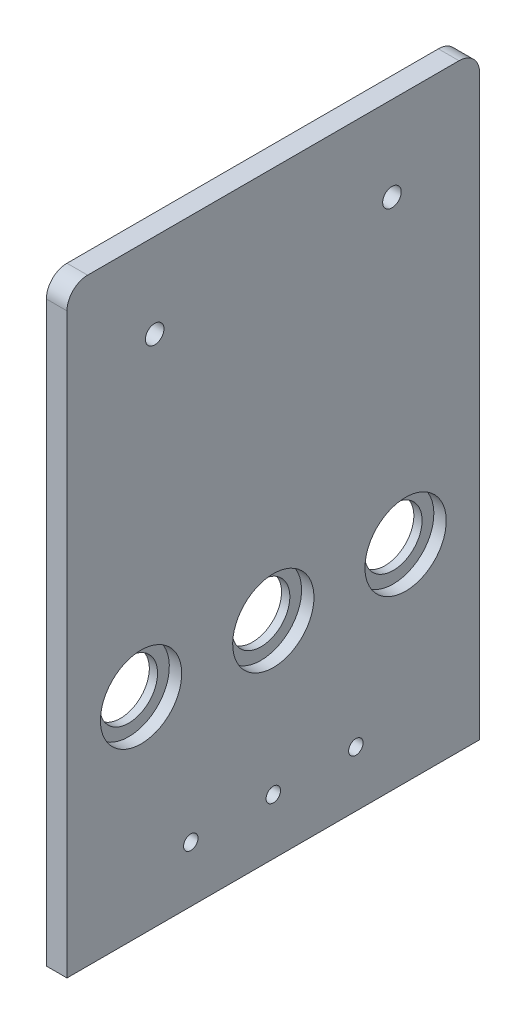
ISO-10303-21;
HEADER;
FILE_DESCRIPTION(('STEP AP214'),'2;1');
FILE_NAME('part.step','',(''),(''),'','','');
FILE_SCHEMA(('AUTOMOTIVE_DESIGN { 1 0 10303 214 1 1 1 1 }'));
ENDSEC;
DATA;
#1=APPLICATION_CONTEXT('core data for automotive mechanical design processes');
#2=APPLICATION_PROTOCOL_DEFINITION('international standard','automotive_design',2000,#1);
#3=PRODUCT_CONTEXT('',#1,'mechanical');
#4=PRODUCT('Part','Part','',(#3));
#5=PRODUCT_RELATED_PRODUCT_CATEGORY('part','',(#4));
#6=PRODUCT_DEFINITION_FORMATION('','',#4);
#7=PRODUCT_DEFINITION_CONTEXT('part definition',#1,'design');
#8=PRODUCT_DEFINITION('design','',#6,#7);
#9=PRODUCT_DEFINITION_SHAPE('','',#8);
#10=(LENGTH_UNIT() NAMED_UNIT(*) SI_UNIT(.MILLI.,.METRE.));
#11=(NAMED_UNIT(*) PLANE_ANGLE_UNIT() SI_UNIT($,.RADIAN.));
#12=(NAMED_UNIT(*) SI_UNIT($,.STERADIAN.) SOLID_ANGLE_UNIT());
#13=UNCERTAINTY_MEASURE_WITH_UNIT(LENGTH_MEASURE(1.E-05),#10,'distance_accuracy_value','');
#14=(GEOMETRIC_REPRESENTATION_CONTEXT(3) GLOBAL_UNCERTAINTY_ASSIGNED_CONTEXT((#13)) GLOBAL_UNIT_ASSIGNED_CONTEXT((#10,
#11,#12)) REPRESENTATION_CONTEXT('',''));
#15=CARTESIAN_POINT('',(0.,0.,0.));
#16=DIRECTION('',(0.,0.,1.));
#17=DIRECTION('',(1.,0.,0.));
#18=AXIS2_PLACEMENT_3D('',#15,#16,#17);
#19=CARTESIAN_POINT('',(0.,-5.,-100.));
#20=DIRECTION('',(0.,-1.,0.));
#21=DIRECTION('',(0.,0.,-1.));
#22=AXIS2_PLACEMENT_3D('',#19,#20,#21);
#23=PLANE('',#22);
#24=DIRECTION('',(1.,0.,0.));
#25=VECTOR('',#24,1.);
#26=CARTESIAN_POINT('',(0.,-5.,-100.));
#27=LINE('',#26,#25);
#28=CARTESIAN_POINT('',(-15.6006101249688,-5.,-100.));
#29=VERTEX_POINT('',#28);
#30=CARTESIAN_POINT('',(-10.6006101249688,-5.,-100.));
#31=VERTEX_POINT('',#30);
#32=EDGE_CURVE('E147',#29,#31,#27,.T.);
#33=ORIENTED_EDGE('',*,*,#32,.T.);
#34=DIRECTION('',(0.,0.,1.));
#35=VECTOR('',#34,1.);
#36=CARTESIAN_POINT('',(-10.6006101249688,-5.,-100.001));
#37=LINE('',#36,#35);
#38=CARTESIAN_POINT('',(-10.6006101249688,-5.,0.));
#39=VERTEX_POINT('',#38);
#40=EDGE_CURVE('E136',#31,#39,#37,.T.);
#41=ORIENTED_EDGE('',*,*,#40,.T.);
#42=DIRECTION('',(1.,0.,0.));
#43=VECTOR('',#42,1.);
#44=CARTESIAN_POINT('',(0.,-5.,0.));
#45=LINE('',#44,#43);
#46=CARTESIAN_POINT('',(-15.6006101249688,-5.,0.));
#47=VERTEX_POINT('',#46);
#48=EDGE_CURVE('E146',#47,#39,#45,.T.);
#49=ORIENTED_EDGE('',*,*,#48,.F.);
#50=DIRECTION('',(0.,0.,1.));
#51=VECTOR('',#50,1.);
#52=CARTESIAN_POINT('',(-15.6006101249688,-5.,-100.));
#53=LINE('',#52,#51);
#54=EDGE_CURVE('E161',#29,#47,#53,.T.);
#55=ORIENTED_EDGE('',*,*,#54,.F.);
#56=EDGE_LOOP('',(#33,#41,#49,#55));
#57=FACE_BOUND('',#56,.T.);
#58=ADVANCED_FACE('F80',(#57),#23,.T.);
#59=CARTESIAN_POINT('',(0.,0.,0.));
#60=DIRECTION('',(0.,0.,1.));
#61=DIRECTION('',(1.,0.,0.));
#62=AXIS2_PLACEMENT_3D('',#59,#60,#61);
#63=PLANE('',#62);
#64=ORIENTED_EDGE('',*,*,#48,.T.);
#65=DIRECTION('',(0.,-1.,0.));
#66=VECTOR('',#65,1.);
#67=CARTESIAN_POINT('',(-10.6006101249688,140.,0.));
#68=LINE('',#67,#66);
#69=CARTESIAN_POINT('',(-10.6006101249688,135.,0.));
#70=VERTEX_POINT('',#69);
#71=EDGE_CURVE('E132',#70,#39,#68,.T.);
#72=ORIENTED_EDGE('',*,*,#71,.F.);
#73=DIRECTION('',(1.,0.,0.));
#74=VECTOR('',#73,1.);
#75=CARTESIAN_POINT('',(-15.6006101249688,135.,0.));
#76=LINE('',#75,#74);
#77=CARTESIAN_POINT('',(-15.6006101249688,135.,0.));
#78=VERTEX_POINT('',#77);
#79=EDGE_CURVE('E12',#70,#78,#76,.F.);
#80=ORIENTED_EDGE('',*,*,#79,.T.);
#81=DIRECTION('',(0.,-1.,0.));
#82=VECTOR('',#81,1.);
#83=CARTESIAN_POINT('',(-15.6006101249688,0.,0.));
#84=LINE('',#83,#82);
#85=EDGE_CURVE('E152',#78,#47,#84,.T.);
#86=ORIENTED_EDGE('',*,*,#85,.T.);
#87=EDGE_LOOP('',(#64,#72,#80,#86));
#88=FACE_BOUND('',#87,.T.);
#89=ADVANCED_FACE('F151',(#88),#63,.T.);
#90=CARTESIAN_POINT('',(0.,0.,-100.));
#91=DIRECTION('',(0.,0.,1.));
#92=DIRECTION('',(1.,0.,0.));
#93=AXIS2_PLACEMENT_3D('',#90,#91,#92);
#94=PLANE('',#93);
#95=DIRECTION('',(0.,-1.,0.));
#96=VECTOR('',#95,1.);
#97=CARTESIAN_POINT('',(-10.6006101249688,140.,-100.));
#98=LINE('',#97,#96);
#99=CARTESIAN_POINT('',(-10.6006101249688,135.,-100.));
#100=VERTEX_POINT('',#99);
#101=EDGE_CURVE('E95',#100,#31,#98,.T.);
#102=ORIENTED_EDGE('',*,*,#101,.T.);
#103=ORIENTED_EDGE('',*,*,#32,.F.);
#104=DIRECTION('',(0.,-1.,0.));
#105=VECTOR('',#104,1.);
#106=CARTESIAN_POINT('',(-15.6006101249688,0.,-100.));
#107=LINE('',#106,#105);
#108=CARTESIAN_POINT('',(-15.6006101249688,135.,-100.));
#109=VERTEX_POINT('',#108);
#110=EDGE_CURVE('E154',#109,#29,#107,.T.);
#111=ORIENTED_EDGE('',*,*,#110,.F.);
#112=DIRECTION('',(1.,0.,0.));
#113=VECTOR('',#112,1.);
#114=CARTESIAN_POINT('',(0.,135.,-100.));
#115=LINE('',#114,#113);
#116=EDGE_CURVE('E163',#109,#100,#115,.T.);
#117=ORIENTED_EDGE('',*,*,#116,.T.);
#118=EDGE_LOOP('',(#102,#103,#111,#117));
#119=FACE_BOUND('',#118,.T.);
#120=ADVANCED_FACE('F200',(#119),#94,.F.);
#121=CARTESIAN_POINT('',(-10.6006101249688,140.,-100.));
#122=DIRECTION('',(-1.,0.,0.));
#123=DIRECTION('',(0.,-1.,0.));
#124=AXIS2_PLACEMENT_3D('',#121,#122,#123);
#125=PLANE('',#124);
#126=CARTESIAN_POINT('',(-10.6006101249688,8.49999999999999,-50.));
#127=DIRECTION('',(1.,0.,0.));
#128=DIRECTION('',(0.,1.,0.));
#129=AXIS2_PLACEMENT_3D('',#126,#127,#128);
#130=CIRCLE('',#129,1.75);
#131=CARTESIAN_POINT('',(-10.6006101249688,10.25,-50.));
#132=VERTEX_POINT('',#131);
#133=EDGE_CURVE('E240',#132,#132,#130,.T.);
#134=ORIENTED_EDGE('',*,*,#133,.F.);
#135=EDGE_LOOP('',(#134));
#136=FACE_BOUND('',#135,.T.);
#137=CARTESIAN_POINT('',(-10.6006101249688,8.49999999999999,-70.));
#138=DIRECTION('',(1.,0.,0.));
#139=DIRECTION('',(0.,1.,0.));
#140=AXIS2_PLACEMENT_3D('',#137,#138,#139);
#141=CIRCLE('',#140,1.75);
#142=CARTESIAN_POINT('',(-10.6006101249688,10.25,-70.));
#143=VERTEX_POINT('',#142);
#144=EDGE_CURVE('E244',#143,#143,#141,.T.);
#145=ORIENTED_EDGE('',*,*,#144,.F.);
#146=EDGE_LOOP('',(#145));
#147=FACE_BOUND('',#146,.T.);
#148=CARTESIAN_POINT('',(-10.6006101249688,8.49999999999999,-30.));
#149=DIRECTION('',(1.,0.,0.));
#150=DIRECTION('',(0.,1.,0.));
#151=AXIS2_PLACEMENT_3D('',#148,#149,#150);
#152=CIRCLE('',#151,1.75000000000001);
#153=CARTESIAN_POINT('',(-10.6006101249688,10.25,-30.));
#154=VERTEX_POINT('',#153);
#155=EDGE_CURVE('E149',#154,#154,#152,.T.);
#156=ORIENTED_EDGE('',*,*,#155,.F.);
#157=EDGE_LOOP('',(#156));
#158=FACE_BOUND('',#157,.T.);
#159=CARTESIAN_POINT('',(-10.6006101249688,119.5,-21.25));
#160=DIRECTION('',(-1.,0.,0.));
#161=DIRECTION('',(0.,-1.,0.));
#162=AXIS2_PLACEMENT_3D('',#159,#160,#161);
#163=CIRCLE('',#162,2.25);
#164=CARTESIAN_POINT('',(-10.6006101249688,121.75,-21.25));
#165=VERTEX_POINT('',#164);
#166=EDGE_CURVE('E148',#165,#165,#163,.F.);
#167=ORIENTED_EDGE('',*,*,#166,.F.);
#168=EDGE_LOOP('',(#167));
#169=FACE_BOUND('',#168,.T.);
#170=CARTESIAN_POINT('',(-10.6006101249688,119.5,-78.75));
#171=DIRECTION('',(-1.,0.,0.));
#172=DIRECTION('',(0.,-1.,0.));
#173=AXIS2_PLACEMENT_3D('',#170,#171,#172);
#174=CIRCLE('',#173,2.25);
#175=CARTESIAN_POINT('',(-10.6006101249688,121.75,-78.75));
#176=VERTEX_POINT('',#175);
#177=EDGE_CURVE('E178',#176,#176,#174,.F.);
#178=ORIENTED_EDGE('',*,*,#177,.F.);
#179=EDGE_LOOP('',(#178));
#180=FACE_BOUND('',#179,.T.);
#181=CARTESIAN_POINT('',(-10.6006101249688,45.,-50.));
#182=DIRECTION('',(-1.,0.,0.));
#183=DIRECTION('',(0.,-1.,0.));
#184=AXIS2_PLACEMENT_3D('',#181,#182,#183);
#185=CIRCLE('',#184,9.84999999999999);
#186=CARTESIAN_POINT('',(-10.6006101249688,35.15,-50.));
#187=VERTEX_POINT('',#186);
#188=EDGE_CURVE('E257',#187,#187,#185,.F.);
#189=ORIENTED_EDGE('',*,*,#188,.F.);
#190=EDGE_LOOP('',(#189));
#191=FACE_BOUND('',#190,.T.);
#192=CARTESIAN_POINT('',(-10.6006101249688,45.,-82.05));
#193=DIRECTION('',(-1.,0.,0.));
#194=DIRECTION('',(0.,-1.,0.));
#195=AXIS2_PLACEMENT_3D('',#192,#193,#194);
#196=CIRCLE('',#195,9.85);
#197=CARTESIAN_POINT('',(-10.6006101249688,35.15,-82.05));
#198=VERTEX_POINT('',#197);
#199=EDGE_CURVE('E260',#198,#198,#196,.F.);
#200=ORIENTED_EDGE('',*,*,#199,.F.);
#201=EDGE_LOOP('',(#200));
#202=FACE_BOUND('',#201,.T.);
#203=ORIENTED_EDGE('',*,*,#101,.F.);
#204=CARTESIAN_POINT('',(-10.6006101249688,135.,-95.));
#205=DIRECTION('',(-1.,0.,0.));
#206=DIRECTION('',(0.,-1.,0.));
#207=AXIS2_PLACEMENT_3D('',#204,#205,#206);
#208=CIRCLE('',#207,5.);
#209=CARTESIAN_POINT('',(-10.6006101249688,140.,-95.));
#210=VERTEX_POINT('',#209);
#211=EDGE_CURVE('E184',#100,#210,#208,.F.);
#212=ORIENTED_EDGE('',*,*,#211,.T.);
#213=DIRECTION('',(0.,0.,1.));
#214=VECTOR('',#213,1.);
#215=CARTESIAN_POINT('',(-10.6006101249688,140.,-100.));
#216=LINE('',#215,#214);
#217=CARTESIAN_POINT('',(-10.6006101249688,140.,-5.));
#218=VERTEX_POINT('',#217);
#219=EDGE_CURVE('E164',#210,#218,#216,.T.);
#220=ORIENTED_EDGE('',*,*,#219,.T.);
#221=CARTESIAN_POINT('',(-10.6006101249688,135.,-5.));
#222=DIRECTION('',(-1.,0.,0.));
#223=DIRECTION('',(0.,-1.,0.));
#224=AXIS2_PLACEMENT_3D('',#221,#222,#223);
#225=CIRCLE('',#224,5.);
#226=EDGE_CURVE('E139',#218,#70,#225,.F.);
#227=ORIENTED_EDGE('',*,*,#226,.T.);
#228=ORIENTED_EDGE('',*,*,#71,.T.);
#229=ORIENTED_EDGE('',*,*,#40,.F.);
#230=EDGE_LOOP('',(#203,#212,#220,#227,#228,#229));
#231=FACE_BOUND('',#230,.T.);
#232=CARTESIAN_POINT('',(-10.6006101249688,45.,-17.95));
#233=DIRECTION('',(-1.,0.,0.));
#234=DIRECTION('',(0.,-1.,0.));
#235=AXIS2_PLACEMENT_3D('',#232,#233,#234);
#236=CIRCLE('',#235,9.85);
#237=CARTESIAN_POINT('',(-10.6006101249688,35.15,-17.95));
#238=VERTEX_POINT('',#237);
#239=EDGE_CURVE('E169',#238,#238,#236,.F.);
#240=ORIENTED_EDGE('',*,*,#239,.F.);
#241=EDGE_LOOP('',(#240));
#242=FACE_BOUND('',#241,.T.);
#243=ADVANCED_FACE('F134',(#136,#147,#158,#169,#180,#191,#202,#231,#242),#125,.F.);
#244=CARTESIAN_POINT('',(-15.6006101249688,0.,-100.));
#245=DIRECTION('',(-1.,0.,0.));
#246=DIRECTION('',(0.,-1.,0.));
#247=AXIS2_PLACEMENT_3D('',#244,#245,#246);
#248=PLANE('',#247);
#249=CARTESIAN_POINT('',(-15.6006101249688,8.49999999999999,-50.));
#250=DIRECTION('',(-1.,0.,0.));
#251=DIRECTION('',(0.,-1.,0.));
#252=AXIS2_PLACEMENT_3D('',#249,#250,#251);
#253=CIRCLE('',#252,1.75);
#254=CARTESIAN_POINT('',(-15.6006101249688,6.74999999999998,-50.));
#255=VERTEX_POINT('',#254);
#256=EDGE_CURVE('E343',#255,#255,#253,.F.);
#257=ORIENTED_EDGE('',*,*,#256,.T.);
#258=EDGE_LOOP('',(#257));
#259=FACE_BOUND('',#258,.T.);
#260=CARTESIAN_POINT('',(-15.6006101249688,8.49999999999999,-70.));
#261=DIRECTION('',(-1.,0.,0.));
#262=DIRECTION('',(0.,-1.,0.));
#263=AXIS2_PLACEMENT_3D('',#260,#261,#262);
#264=CIRCLE('',#263,1.75);
#265=CARTESIAN_POINT('',(-15.6006101249688,6.74999999999999,-70.));
#266=VERTEX_POINT('',#265);
#267=EDGE_CURVE('E351',#266,#266,#264,.F.);
#268=ORIENTED_EDGE('',*,*,#267,.T.);
#269=EDGE_LOOP('',(#268));
#270=FACE_BOUND('',#269,.T.);
#271=CARTESIAN_POINT('',(-15.6006101249688,8.49999999999999,-30.));
#272=DIRECTION('',(-1.,0.,0.));
#273=DIRECTION('',(0.,-1.,0.));
#274=AXIS2_PLACEMENT_3D('',#271,#272,#273);
#275=CIRCLE('',#274,1.75000000000001);
#276=CARTESIAN_POINT('',(-15.6006101249688,6.74999999999998,-30.));
#277=VERTEX_POINT('',#276);
#278=EDGE_CURVE('E344',#277,#277,#275,.F.);
#279=ORIENTED_EDGE('',*,*,#278,.T.);
#280=EDGE_LOOP('',(#279));
#281=FACE_BOUND('',#280,.T.);
#282=CARTESIAN_POINT('',(-15.6006101249688,119.5,-21.25));
#283=DIRECTION('',(-1.,0.,0.));
#284=DIRECTION('',(0.,-1.,0.));
#285=AXIS2_PLACEMENT_3D('',#282,#283,#284);
#286=CIRCLE('',#285,2.25);
#287=CARTESIAN_POINT('',(-15.6006101249688,121.75,-21.25));
#288=VERTEX_POINT('',#287);
#289=EDGE_CURVE('E179',#288,#288,#286,.F.);
#290=ORIENTED_EDGE('',*,*,#289,.T.);
#291=EDGE_LOOP('',(#290));
#292=FACE_BOUND('',#291,.T.);
#293=CARTESIAN_POINT('',(-15.6006101249688,119.5,-78.75));
#294=DIRECTION('',(-1.,0.,0.));
#295=DIRECTION('',(0.,-1.,0.));
#296=AXIS2_PLACEMENT_3D('',#293,#294,#295);
#297=CIRCLE('',#296,2.25);
#298=CARTESIAN_POINT('',(-15.6006101249688,121.75,-78.75));
#299=VERTEX_POINT('',#298);
#300=EDGE_CURVE('E174',#299,#299,#297,.F.);
#301=ORIENTED_EDGE('',*,*,#300,.T.);
#302=EDGE_LOOP('',(#301));
#303=FACE_BOUND('',#302,.T.);
#304=CARTESIAN_POINT('',(-15.6006101249688,45.,-50.));
#305=DIRECTION('',(-1.,0.,0.));
#306=DIRECTION('',(0.,0.,1.));
#307=AXIS2_PLACEMENT_3D('',#304,#305,#306);
#308=CIRCLE('',#307,7.);
#309=CARTESIAN_POINT('',(-15.6006101249688,45.,-43.));
#310=VERTEX_POINT('',#309);
#311=EDGE_CURVE('E277',#310,#310,#308,.T.);
#312=ORIENTED_EDGE('',*,*,#311,.F.);
#313=EDGE_LOOP('',(#312));
#314=FACE_BOUND('',#313,.T.);
#315=CARTESIAN_POINT('',(-15.6006101249688,45.,-17.95));
#316=DIRECTION('',(-1.,0.,0.));
#317=DIRECTION('',(0.,0.,1.));
#318=AXIS2_PLACEMENT_3D('',#315,#316,#317);
#319=CIRCLE('',#318,7.);
#320=CARTESIAN_POINT('',(-15.6006101249688,45.,-10.95));
#321=VERTEX_POINT('',#320);
#322=EDGE_CURVE('E172',#321,#321,#319,.T.);
#323=ORIENTED_EDGE('',*,*,#322,.F.);
#324=EDGE_LOOP('',(#323));
#325=FACE_BOUND('',#324,.T.);
#326=CARTESIAN_POINT('',(-15.6006101249688,45.,-82.05));
#327=DIRECTION('',(-1.,0.,0.));
#328=DIRECTION('',(0.,0.,1.));
#329=AXIS2_PLACEMENT_3D('',#326,#327,#328);
#330=CIRCLE('',#329,7.);
#331=CARTESIAN_POINT('',(-15.6006101249688,45.,-75.05));
#332=VERTEX_POINT('',#331);
#333=EDGE_CURVE('E141',#332,#332,#330,.T.);
#334=ORIENTED_EDGE('',*,*,#333,.F.);
#335=EDGE_LOOP('',(#334));
#336=FACE_BOUND('',#335,.T.);
#337=DIRECTION('',(0.,0.,1.));
#338=VECTOR('',#337,1.);
#339=CARTESIAN_POINT('',(-15.6006101249688,140.,-100.));
#340=LINE('',#339,#338);
#341=CARTESIAN_POINT('',(-15.6006101249688,140.,-95.));
#342=VERTEX_POINT('',#341);
#343=CARTESIAN_POINT('',(-15.6006101249688,140.,-5.));
#344=VERTEX_POINT('',#343);
#345=EDGE_CURVE('E157',#342,#344,#340,.T.);
#346=ORIENTED_EDGE('',*,*,#345,.F.);
#347=CARTESIAN_POINT('',(-15.6006101249688,135.,-95.));
#348=DIRECTION('',(-1.,0.,0.));
#349=DIRECTION('',(0.,-1.,0.));
#350=AXIS2_PLACEMENT_3D('',#347,#348,#349);
#351=CIRCLE('',#350,5.);
#352=EDGE_CURVE('E88',#342,#109,#351,.T.);
#353=ORIENTED_EDGE('',*,*,#352,.T.);
#354=ORIENTED_EDGE('',*,*,#110,.T.);
#355=ORIENTED_EDGE('',*,*,#54,.T.);
#356=ORIENTED_EDGE('',*,*,#85,.F.);
#357=CARTESIAN_POINT('',(-15.6006101249688,135.,-5.));
#358=DIRECTION('',(-1.,0.,0.));
#359=DIRECTION('',(0.,-1.,0.));
#360=AXIS2_PLACEMENT_3D('',#357,#358,#359);
#361=CIRCLE('',#360,5.);
#362=EDGE_CURVE('E191',#78,#344,#361,.T.);
#363=ORIENTED_EDGE('',*,*,#362,.T.);
#364=EDGE_LOOP('',(#346,#353,#354,#355,#356,#363));
#365=FACE_BOUND('',#364,.T.);
#366=ADVANCED_FACE('F196',(#259,#270,#281,#292,#303,#314,#325,#336,#365),#248,.T.);
#367=CARTESIAN_POINT('',(-15.6006101249688,140.,-100.));
#368=DIRECTION('',(0.,-1.,0.));
#369=DIRECTION('',(0.,0.,-1.));
#370=AXIS2_PLACEMENT_3D('',#367,#368,#369);
#371=PLANE('',#370);
#372=ORIENTED_EDGE('',*,*,#219,.F.);
#373=DIRECTION('',(1.,0.,0.));
#374=VECTOR('',#373,1.);
#375=CARTESIAN_POINT('',(-15.6006101249688,140.,-95.));
#376=LINE('',#375,#374);
#377=EDGE_CURVE('E189',#210,#342,#376,.F.);
#378=ORIENTED_EDGE('',*,*,#377,.T.);
#379=ORIENTED_EDGE('',*,*,#345,.T.);
#380=DIRECTION('',(1.,0.,0.));
#381=VECTOR('',#380,1.);
#382=CARTESIAN_POINT('',(-10.6006101249688,140.,-5.));
#383=LINE('',#382,#381);
#384=EDGE_CURVE('E186',#344,#218,#383,.T.);
#385=ORIENTED_EDGE('',*,*,#384,.T.);
#386=EDGE_LOOP('',(#372,#378,#379,#385));
#387=FACE_BOUND('',#386,.T.);
#388=ADVANCED_FACE('F204',(#387),#371,.F.);
#389=CARTESIAN_POINT('',(-15.6006101249688,45.,-82.05));
#390=DIRECTION('',(1.,0.,0.));
#391=DIRECTION('',(0.,0.,-1.));
#392=AXIS2_PLACEMENT_3D('',#389,#390,#391);
#393=CYLINDRICAL_SURFACE('',#392,7.);
#394=CARTESIAN_POINT('',(-13.6006101249688,45.,-82.05));
#395=DIRECTION('',(-1.,0.,0.));
#396=DIRECTION('',(0.,0.,1.));
#397=AXIS2_PLACEMENT_3D('',#394,#395,#396);
#398=CIRCLE('',#397,7.);
#399=CARTESIAN_POINT('',(-13.6006101249688,45.,-75.05));
#400=VERTEX_POINT('',#399);
#401=EDGE_CURVE('E177',#400,#400,#398,.T.);
#402=ORIENTED_EDGE('',*,*,#401,.F.);
#403=EDGE_LOOP('',(#402));
#404=FACE_BOUND('',#403,.T.);
#405=ORIENTED_EDGE('',*,*,#333,.T.);
#406=EDGE_LOOP('',(#405));
#407=FACE_BOUND('',#406,.T.);
#408=ADVANCED_FACE('F229',(#404,#407),#393,.F.);
#409=CARTESIAN_POINT('',(-15.6006101249688,45.,-17.95));
#410=DIRECTION('',(1.,0.,0.));
#411=DIRECTION('',(0.,0.,-1.));
#412=AXIS2_PLACEMENT_3D('',#409,#410,#411);
#413=CYLINDRICAL_SURFACE('',#412,7.);
#414=CARTESIAN_POINT('',(-13.6006101249688,45.,-17.95));
#415=DIRECTION('',(-1.,0.,0.));
#416=DIRECTION('',(0.,0.,1.));
#417=AXIS2_PLACEMENT_3D('',#414,#415,#416);
#418=CIRCLE('',#417,7.);
#419=CARTESIAN_POINT('',(-13.6006101249688,45.,-10.95));
#420=VERTEX_POINT('',#419);
#421=EDGE_CURVE('E173',#420,#420,#418,.T.);
#422=ORIENTED_EDGE('',*,*,#421,.F.);
#423=EDGE_LOOP('',(#422));
#424=FACE_BOUND('',#423,.T.);
#425=ORIENTED_EDGE('',*,*,#322,.T.);
#426=EDGE_LOOP('',(#425));
#427=FACE_BOUND('',#426,.T.);
#428=ADVANCED_FACE('F287',(#424,#427),#413,.F.);
#429=CARTESIAN_POINT('',(-15.6006101249688,45.,-50.));
#430=DIRECTION('',(1.,0.,0.));
#431=DIRECTION('',(0.,0.,-1.));
#432=AXIS2_PLACEMENT_3D('',#429,#430,#431);
#433=CYLINDRICAL_SURFACE('',#432,7.);
#434=CARTESIAN_POINT('',(-13.6006101249688,45.,-50.));
#435=DIRECTION('',(-1.,0.,0.));
#436=DIRECTION('',(0.,0.,1.));
#437=AXIS2_PLACEMENT_3D('',#434,#435,#436);
#438=CIRCLE('',#437,7.);
#439=CARTESIAN_POINT('',(-13.6006101249688,45.,-43.));
#440=VERTEX_POINT('',#439);
#441=EDGE_CURVE('E262',#440,#440,#438,.T.);
#442=ORIENTED_EDGE('',*,*,#441,.F.);
#443=EDGE_LOOP('',(#442));
#444=FACE_BOUND('',#443,.T.);
#445=ORIENTED_EDGE('',*,*,#311,.T.);
#446=EDGE_LOOP('',(#445));
#447=FACE_BOUND('',#446,.T.);
#448=ADVANCED_FACE('F293',(#444,#447),#433,.F.);
#449=CARTESIAN_POINT('',(-13.6006101249688,45.,-17.95));
#450=DIRECTION('',(1.,0.,0.));
#451=DIRECTION('',(0.,0.,-1.));
#452=AXIS2_PLACEMENT_3D('',#449,#450,#451);
#453=CYLINDRICAL_SURFACE('',#452,9.85);
#454=CARTESIAN_POINT('',(-13.6006101249688,45.,-17.95));
#455=DIRECTION('',(-1.,0.,0.));
#456=DIRECTION('',(0.,0.,1.));
#457=AXIS2_PLACEMENT_3D('',#454,#455,#456);
#458=CIRCLE('',#457,9.85);
#459=CARTESIAN_POINT('',(-13.6006101249688,45.,-8.10000000000001));
#460=VERTEX_POINT('',#459);
#461=EDGE_CURVE('E264',#460,#460,#458,.T.);
#462=ORIENTED_EDGE('',*,*,#461,.T.);
#463=EDGE_LOOP('',(#462));
#464=FACE_BOUND('',#463,.T.);
#465=ORIENTED_EDGE('',*,*,#239,.T.);
#466=EDGE_LOOP('',(#465));
#467=FACE_BOUND('',#466,.T.);
#468=ADVANCED_FACE('F300',(#464,#467),#453,.F.);
#469=CARTESIAN_POINT('',(-13.6006101249688,0.,0.));
#470=DIRECTION('',(-1.,0.,0.));
#471=DIRECTION('',(0.,0.,1.));
#472=AXIS2_PLACEMENT_3D('',#469,#470,#471);
#473=PLANE('',#472);
#474=ORIENTED_EDGE('',*,*,#461,.F.);
#475=EDGE_LOOP('',(#474));
#476=FACE_BOUND('',#475,.T.);
#477=ORIENTED_EDGE('',*,*,#421,.T.);
#478=EDGE_LOOP('',(#477));
#479=FACE_BOUND('',#478,.T.);
#480=ADVANCED_FACE('F304',(#476,#479),#473,.F.);
#481=CARTESIAN_POINT('',(-13.6006101249688,45.,-50.));
#482=DIRECTION('',(1.,0.,0.));
#483=DIRECTION('',(0.,0.,-1.));
#484=AXIS2_PLACEMENT_3D('',#481,#482,#483);
#485=CYLINDRICAL_SURFACE('',#484,9.84999999999999);
#486=CARTESIAN_POINT('',(-13.6006101249688,45.,-50.));
#487=DIRECTION('',(-1.,0.,0.));
#488=DIRECTION('',(0.,0.,1.));
#489=AXIS2_PLACEMENT_3D('',#486,#487,#488);
#490=CIRCLE('',#489,9.84999999999999);
#491=CARTESIAN_POINT('',(-13.6006101249688,45.,-40.15));
#492=VERTEX_POINT('',#491);
#493=EDGE_CURVE('E267',#492,#492,#490,.T.);
#494=ORIENTED_EDGE('',*,*,#493,.T.);
#495=EDGE_LOOP('',(#494));
#496=FACE_BOUND('',#495,.T.);
#497=ORIENTED_EDGE('',*,*,#188,.T.);
#498=EDGE_LOOP('',(#497));
#499=FACE_BOUND('',#498,.T.);
#500=ADVANCED_FACE('F308',(#496,#499),#485,.F.);
#501=CARTESIAN_POINT('',(-13.6006101249688,0.,0.));
#502=DIRECTION('',(-1.,0.,0.));
#503=DIRECTION('',(0.,0.,1.));
#504=AXIS2_PLACEMENT_3D('',#501,#502,#503);
#505=PLANE('',#504);
#506=ORIENTED_EDGE('',*,*,#493,.F.);
#507=EDGE_LOOP('',(#506));
#508=FACE_BOUND('',#507,.T.);
#509=ORIENTED_EDGE('',*,*,#441,.T.);
#510=EDGE_LOOP('',(#509));
#511=FACE_BOUND('',#510,.T.);
#512=ADVANCED_FACE('F314',(#508,#511),#505,.F.);
#513=CARTESIAN_POINT('',(-13.6006101249688,45.,-82.05));
#514=DIRECTION('',(1.,0.,0.));
#515=DIRECTION('',(0.,0.,-1.));
#516=AXIS2_PLACEMENT_3D('',#513,#514,#515);
#517=CYLINDRICAL_SURFACE('',#516,9.85);
#518=CARTESIAN_POINT('',(-13.6006101249688,45.,-82.05));
#519=DIRECTION('',(-1.,0.,0.));
#520=DIRECTION('',(0.,0.,1.));
#521=AXIS2_PLACEMENT_3D('',#518,#519,#520);
#522=CIRCLE('',#521,9.85);
#523=CARTESIAN_POINT('',(-13.6006101249688,45.,-72.2));
#524=VERTEX_POINT('',#523);
#525=EDGE_CURVE('E270',#524,#524,#522,.T.);
#526=ORIENTED_EDGE('',*,*,#525,.T.);
#527=EDGE_LOOP('',(#526));
#528=FACE_BOUND('',#527,.T.);
#529=ORIENTED_EDGE('',*,*,#199,.T.);
#530=EDGE_LOOP('',(#529));
#531=FACE_BOUND('',#530,.T.);
#532=ADVANCED_FACE('F310',(#528,#531),#517,.F.);
#533=CARTESIAN_POINT('',(-13.6006101249688,0.,0.));
#534=DIRECTION('',(-1.,0.,0.));
#535=DIRECTION('',(0.,0.,1.));
#536=AXIS2_PLACEMENT_3D('',#533,#534,#535);
#537=PLANE('',#536);
#538=ORIENTED_EDGE('',*,*,#401,.T.);
#539=EDGE_LOOP('',(#538));
#540=FACE_BOUND('',#539,.T.);
#541=ORIENTED_EDGE('',*,*,#525,.F.);
#542=EDGE_LOOP('',(#541));
#543=FACE_BOUND('',#542,.T.);
#544=ADVANCED_FACE('F313',(#540,#543),#537,.F.);
#545=CARTESIAN_POINT('',(-15.6006221249688,119.5,-78.75));
#546=DIRECTION('',(1.,0.,0.));
#547=DIRECTION('',(0.,1.,0.));
#548=AXIS2_PLACEMENT_3D('',#545,#546,#547);
#549=CYLINDRICAL_SURFACE('',#548,2.25);
#550=CARTESIAN_POINT('',(-15.6006101249688,121.75,-78.75));
#551=CARTESIAN_POINT('',(-15.5485267916355,121.75,-78.75));
#552=CARTESIAN_POINT('',(-15.4964434583021,121.75,-78.75));
#553=CARTESIAN_POINT('',(-15.3922767916355,121.75,-78.75));
#554=CARTESIAN_POINT('',(-15.3401934583021,121.75,-78.75));
#555=CARTESIAN_POINT('',(-15.2360267916355,121.75,-78.75));
#556=CARTESIAN_POINT('',(-15.1839434583021,121.75,-78.75));
#557=CARTESIAN_POINT('',(-15.0797767916355,121.75,-78.75));
#558=CARTESIAN_POINT('',(-15.0276934583021,121.75,-78.75));
#559=CARTESIAN_POINT('',(-14.9235267916355,121.75,-78.75));
#560=CARTESIAN_POINT('',(-14.8714434583021,121.75,-78.75));
#561=CARTESIAN_POINT('',(-14.7672767916355,121.75,-78.75));
#562=CARTESIAN_POINT('',(-14.7151934583021,121.75,-78.75));
#563=CARTESIAN_POINT('',(-14.6110267916355,121.75,-78.75));
#564=CARTESIAN_POINT('',(-14.5589434583021,121.75,-78.75));
#565=CARTESIAN_POINT('',(-14.4547767916355,121.75,-78.75));
#566=CARTESIAN_POINT('',(-14.4026934583021,121.75,-78.75));
#567=CARTESIAN_POINT('',(-14.2985267916355,121.75,-78.75));
#568=CARTESIAN_POINT('',(-14.2464434583021,121.75,-78.75));
#569=CARTESIAN_POINT('',(-14.1422767916355,121.75,-78.75));
#570=CARTESIAN_POINT('',(-14.0901934583021,121.75,-78.75));
#571=CARTESIAN_POINT('',(-13.9860267916355,121.75,-78.75));
#572=CARTESIAN_POINT('',(-13.9339434583021,121.75,-78.75));
#573=CARTESIAN_POINT('',(-13.8297767916355,121.75,-78.75));
#574=CARTESIAN_POINT('',(-13.7776934583021,121.75,-78.75));
#575=CARTESIAN_POINT('',(-13.6735267916355,121.75,-78.75));
#576=CARTESIAN_POINT('',(-13.6214434583021,121.75,-78.75));
#577=CARTESIAN_POINT('',(-13.5172767916355,121.75,-78.75));
#578=CARTESIAN_POINT('',(-13.4651934583021,121.75,-78.75));
#579=CARTESIAN_POINT('',(-13.3610267916355,121.75,-78.75));
#580=CARTESIAN_POINT('',(-13.3089434583021,121.75,-78.75));
#581=CARTESIAN_POINT('',(-13.2047767916355,121.75,-78.75));
#582=CARTESIAN_POINT('',(-13.1526934583021,121.75,-78.75));
#583=CARTESIAN_POINT('',(-13.0485267916354,121.75,-78.75));
#584=CARTESIAN_POINT('',(-12.9964434583021,121.75,-78.75));
#585=CARTESIAN_POINT('',(-12.8922767916354,121.75,-78.75));
#586=CARTESIAN_POINT('',(-12.8401934583021,121.75,-78.75));
#587=CARTESIAN_POINT('',(-12.7360267916354,121.75,-78.75));
#588=CARTESIAN_POINT('',(-12.6839434583021,121.75,-78.75));
#589=CARTESIAN_POINT('',(-12.5797767916354,121.75,-78.75));
#590=CARTESIAN_POINT('',(-12.5276934583021,121.75,-78.75));
#591=CARTESIAN_POINT('',(-12.4235267916354,121.75,-78.75));
#592=CARTESIAN_POINT('',(-12.3714434583021,121.75,-78.75));
#593=CARTESIAN_POINT('',(-12.2672767916354,121.75,-78.75));
#594=CARTESIAN_POINT('',(-12.2151934583021,121.75,-78.75));
#595=CARTESIAN_POINT('',(-12.1110267916354,121.75,-78.75));
#596=CARTESIAN_POINT('',(-12.0589434583021,121.75,-78.75));
#597=CARTESIAN_POINT('',(-11.9547767916354,121.75,-78.75));
#598=CARTESIAN_POINT('',(-11.9026934583021,121.75,-78.75));
#599=CARTESIAN_POINT('',(-11.7985267916354,121.75,-78.75));
#600=CARTESIAN_POINT('',(-11.7464434583021,121.75,-78.75));
#601=CARTESIAN_POINT('',(-11.6422767916354,121.75,-78.75));
#602=CARTESIAN_POINT('',(-11.5901934583021,121.75,-78.75));
#603=CARTESIAN_POINT('',(-11.4860267916354,121.75,-78.75));
#604=CARTESIAN_POINT('',(-11.4339434583021,121.75,-78.75));
#605=CARTESIAN_POINT('',(-11.3297767916354,121.75,-78.75));
#606=CARTESIAN_POINT('',(-11.2776934583021,121.75,-78.75));
#607=CARTESIAN_POINT('',(-11.1735267916354,121.75,-78.75));
#608=CARTESIAN_POINT('',(-11.1214434583021,121.75,-78.75));
#609=CARTESIAN_POINT('',(-11.0172767916354,121.75,-78.75));
#610=CARTESIAN_POINT('',(-10.9651934583021,121.75,-78.75));
#611=CARTESIAN_POINT('',(-10.8610267916354,121.75,-78.75));
#612=CARTESIAN_POINT('',(-10.8089434583021,121.75,-78.75));
#613=CARTESIAN_POINT('',(-10.7047767916354,121.75,-78.75));
#614=CARTESIAN_POINT('',(-10.6526934583021,121.75,-78.75));
#615=CARTESIAN_POINT('',(-10.6006101249688,121.75,-78.75));
#616=B_SPLINE_CURVE_WITH_KNOTS('',3,(#550,#551,#552,#553,#554,#555,#556,#557,#558,#559,#560,
#561,#562,#563,#564,#565,#566,#567,#568,#569,#570,#571,#572,#573,#574,#575,#576,#577,#578,#579,
#580,#581,#582,#583,#584,#585,#586,#587,#588,#589,#590,#591,#592,#593,#594,#595,#596,#597,#598,
#599,#600,#601,#602,#603,#604,#605,#606,#607,#608,#609,#610,#611,#612,#613,#614,#615),
.UNSPECIFIED.,.F.,.F.,(4,2,2,2,2,2,2,2,2,2,2,2,2,2,2,2,2,2,2,2,2,2,2,2,2,2,2,2,2,2,2,2,4),(0.,
0.156250000000002,0.312500000000002,0.468750000000004,0.625000000000004,0.781250000000006,
0.937500000000006,1.09375000000001,1.25000000000001,1.40625000000001,1.56250000000001,
1.71875000000001,1.87500000000001,2.03125000000001,2.18750000000001,2.34375000000001,
2.50000000000001,2.65625000000002,2.81250000000002,2.96875000000002,3.12500000000002,
3.28125000000002,3.43750000000002,3.59375000000002,3.75000000000002,3.90625000000002,
4.06250000000002,4.21875000000002,4.37500000000003,4.53125000000003,4.68750000000003,
4.84375000000003,5.00000000000003),.UNSPECIFIED.);
#617=EDGE_CURVE('BSEAM318',#299,#176,#616,.T.);
#618=ORIENTED_EDGE('',*,*,#300,.F.);
#619=ORIENTED_EDGE('',*,*,#177,.T.);
#620=ORIENTED_EDGE('',*,*,#617,.T.);
#621=ORIENTED_EDGE('',*,*,#617,.F.);
#622=EDGE_LOOP('',(#618,#620,#619,#621));
#623=FACE_BOUND('',#622,.T.);
#624=ADVANCED_FACE('F318',(#623),#549,.F.);
#625=CARTESIAN_POINT('',(-15.6006221249688,119.5,-21.25));
#626=DIRECTION('',(1.,0.,0.));
#627=DIRECTION('',(0.,1.,0.));
#628=AXIS2_PLACEMENT_3D('',#625,#626,#627);
#629=CYLINDRICAL_SURFACE('',#628,2.25);
#630=CARTESIAN_POINT('',(-15.6006101249688,121.75,-21.25));
#631=CARTESIAN_POINT('',(-15.5485267916355,121.75,-21.25));
#632=CARTESIAN_POINT('',(-15.4964434583021,121.75,-21.25));
#633=CARTESIAN_POINT('',(-15.3922767916355,121.75,-21.25));
#634=CARTESIAN_POINT('',(-15.3401934583021,121.75,-21.25));
#635=CARTESIAN_POINT('',(-15.2360267916355,121.75,-21.25));
#636=CARTESIAN_POINT('',(-15.1839434583021,121.75,-21.25));
#637=CARTESIAN_POINT('',(-15.0797767916355,121.75,-21.25));
#638=CARTESIAN_POINT('',(-15.0276934583021,121.75,-21.25));
#639=CARTESIAN_POINT('',(-14.9235267916355,121.75,-21.25));
#640=CARTESIAN_POINT('',(-14.8714434583021,121.75,-21.25));
#641=CARTESIAN_POINT('',(-14.7672767916355,121.75,-21.25));
#642=CARTESIAN_POINT('',(-14.7151934583021,121.75,-21.25));
#643=CARTESIAN_POINT('',(-14.6110267916355,121.75,-21.25));
#644=CARTESIAN_POINT('',(-14.5589434583021,121.75,-21.25));
#645=CARTESIAN_POINT('',(-14.4547767916355,121.75,-21.25));
#646=CARTESIAN_POINT('',(-14.4026934583021,121.75,-21.25));
#647=CARTESIAN_POINT('',(-14.2985267916355,121.75,-21.25));
#648=CARTESIAN_POINT('',(-14.2464434583021,121.75,-21.25));
#649=CARTESIAN_POINT('',(-14.1422767916355,121.75,-21.25));
#650=CARTESIAN_POINT('',(-14.0901934583021,121.75,-21.25));
#651=CARTESIAN_POINT('',(-13.9860267916355,121.75,-21.25));
#652=CARTESIAN_POINT('',(-13.9339434583021,121.75,-21.25));
#653=CARTESIAN_POINT('',(-13.8297767916355,121.75,-21.25));
#654=CARTESIAN_POINT('',(-13.7776934583021,121.75,-21.25));
#655=CARTESIAN_POINT('',(-13.6735267916355,121.75,-21.25));
#656=CARTESIAN_POINT('',(-13.6214434583021,121.75,-21.25));
#657=CARTESIAN_POINT('',(-13.5172767916355,121.75,-21.25));
#658=CARTESIAN_POINT('',(-13.4651934583021,121.75,-21.25));
#659=CARTESIAN_POINT('',(-13.3610267916355,121.75,-21.25));
#660=CARTESIAN_POINT('',(-13.3089434583021,121.75,-21.25));
#661=CARTESIAN_POINT('',(-13.2047767916355,121.75,-21.25));
#662=CARTESIAN_POINT('',(-13.1526934583021,121.75,-21.25));
#663=CARTESIAN_POINT('',(-13.0485267916354,121.75,-21.25));
#664=CARTESIAN_POINT('',(-12.9964434583021,121.75,-21.25));
#665=CARTESIAN_POINT('',(-12.8922767916354,121.75,-21.25));
#666=CARTESIAN_POINT('',(-12.8401934583021,121.75,-21.25));
#667=CARTESIAN_POINT('',(-12.7360267916354,121.75,-21.25));
#668=CARTESIAN_POINT('',(-12.6839434583021,121.75,-21.25));
#669=CARTESIAN_POINT('',(-12.5797767916354,121.75,-21.25));
#670=CARTESIAN_POINT('',(-12.5276934583021,121.75,-21.25));
#671=CARTESIAN_POINT('',(-12.4235267916354,121.75,-21.25));
#672=CARTESIAN_POINT('',(-12.3714434583021,121.75,-21.25));
#673=CARTESIAN_POINT('',(-12.2672767916354,121.75,-21.25));
#674=CARTESIAN_POINT('',(-12.2151934583021,121.75,-21.25));
#675=CARTESIAN_POINT('',(-12.1110267916354,121.75,-21.25));
#676=CARTESIAN_POINT('',(-12.0589434583021,121.75,-21.25));
#677=CARTESIAN_POINT('',(-11.9547767916354,121.75,-21.25));
#678=CARTESIAN_POINT('',(-11.9026934583021,121.75,-21.25));
#679=CARTESIAN_POINT('',(-11.7985267916354,121.75,-21.25));
#680=CARTESIAN_POINT('',(-11.7464434583021,121.75,-21.25));
#681=CARTESIAN_POINT('',(-11.6422767916354,121.75,-21.25));
#682=CARTESIAN_POINT('',(-11.5901934583021,121.75,-21.25));
#683=CARTESIAN_POINT('',(-11.4860267916354,121.75,-21.25));
#684=CARTESIAN_POINT('',(-11.4339434583021,121.75,-21.25));
#685=CARTESIAN_POINT('',(-11.3297767916354,121.75,-21.25));
#686=CARTESIAN_POINT('',(-11.2776934583021,121.75,-21.25));
#687=CARTESIAN_POINT('',(-11.1735267916354,121.75,-21.25));
#688=CARTESIAN_POINT('',(-11.1214434583021,121.75,-21.25));
#689=CARTESIAN_POINT('',(-11.0172767916354,121.75,-21.25));
#690=CARTESIAN_POINT('',(-10.9651934583021,121.75,-21.25));
#691=CARTESIAN_POINT('',(-10.8610267916354,121.75,-21.25));
#692=CARTESIAN_POINT('',(-10.8089434583021,121.75,-21.25));
#693=CARTESIAN_POINT('',(-10.7047767916354,121.75,-21.25));
#694=CARTESIAN_POINT('',(-10.6526934583021,121.75,-21.25));
#695=CARTESIAN_POINT('',(-10.6006101249688,121.75,-21.25));
#696=B_SPLINE_CURVE_WITH_KNOTS('',3,(#630,#631,#632,#633,#634,#635,#636,#637,#638,#639,#640,
#641,#642,#643,#644,#645,#646,#647,#648,#649,#650,#651,#652,#653,#654,#655,#656,#657,#658,#659,
#660,#661,#662,#663,#664,#665,#666,#667,#668,#669,#670,#671,#672,#673,#674,#675,#676,#677,#678,
#679,#680,#681,#682,#683,#684,#685,#686,#687,#688,#689,#690,#691,#692,#693,#694,#695),
.UNSPECIFIED.,.F.,.F.,(4,2,2,2,2,2,2,2,2,2,2,2,2,2,2,2,2,2,2,2,2,2,2,2,2,2,2,2,2,2,2,2,4),(0.,
0.156250000000002,0.312500000000002,0.468750000000004,0.625000000000004,0.781250000000006,
0.937500000000006,1.09375000000001,1.25000000000001,1.40625000000001,1.56250000000001,
1.71875000000001,1.87500000000001,2.03125000000001,2.18750000000001,2.34375000000001,
2.50000000000001,2.65625000000002,2.81250000000002,2.96875000000002,3.12500000000002,
3.28125000000002,3.43750000000002,3.59375000000002,3.75000000000002,3.90625000000002,
4.06250000000002,4.21875000000002,4.37500000000003,4.53125000000003,4.68750000000003,
4.84375000000003,5.00000000000003),.UNSPECIFIED.);
#697=EDGE_CURVE('BSEAM217',#288,#165,#696,.T.);
#698=ORIENTED_EDGE('',*,*,#289,.F.);
#699=ORIENTED_EDGE('',*,*,#166,.T.);
#700=ORIENTED_EDGE('',*,*,#697,.T.);
#701=ORIENTED_EDGE('',*,*,#697,.F.);
#702=EDGE_LOOP('',(#698,#700,#699,#701));
#703=FACE_BOUND('',#702,.T.);
#704=ADVANCED_FACE('F217',(#703),#629,.F.);
#705=CARTESIAN_POINT('',(0.,135.,-95.));
#706=DIRECTION('',(1.,0.,0.));
#707=DIRECTION('',(0.,0.,-1.));
#708=AXIS2_PLACEMENT_3D('',#705,#706,#707);
#709=CYLINDRICAL_SURFACE('',#708,5.);
#710=ORIENTED_EDGE('',*,*,#352,.F.);
#711=ORIENTED_EDGE('',*,*,#377,.F.);
#712=ORIENTED_EDGE('',*,*,#211,.F.);
#713=ORIENTED_EDGE('',*,*,#116,.F.);
#714=EDGE_LOOP('',(#710,#711,#712,#713));
#715=FACE_BOUND('',#714,.T.);
#716=ADVANCED_FACE('F201',(#715),#709,.T.);
#717=CARTESIAN_POINT('',(-15.6006101249688,135.,-5.));
#718=DIRECTION('',(-1.,0.,0.));
#719=DIRECTION('',(0.,0.,1.));
#720=AXIS2_PLACEMENT_3D('',#717,#718,#719);
#721=CYLINDRICAL_SURFACE('',#720,5.);
#722=ORIENTED_EDGE('',*,*,#362,.F.);
#723=ORIENTED_EDGE('',*,*,#79,.F.);
#724=ORIENTED_EDGE('',*,*,#226,.F.);
#725=ORIENTED_EDGE('',*,*,#384,.F.);
#726=EDGE_LOOP('',(#722,#723,#724,#725));
#727=FACE_BOUND('',#726,.T.);
#728=ADVANCED_FACE('F82',(#727),#721,.T.);
#729=CARTESIAN_POINT('',(-15.6016101249688,8.49999999999999,-30.));
#730=DIRECTION('',(1.,0.,0.));
#731=DIRECTION('',(0.,1.,0.));
#732=AXIS2_PLACEMENT_3D('',#729,#730,#731);
#733=CYLINDRICAL_SURFACE('',#732,1.75000000000001);
#734=ORIENTED_EDGE('',*,*,#278,.F.);
#735=EDGE_LOOP('',(#734));
#736=FACE_BOUND('',#735,.T.);
#737=ORIENTED_EDGE('',*,*,#155,.T.);
#738=EDGE_LOOP('',(#737));
#739=FACE_BOUND('',#738,.T.);
#740=ADVANCED_FACE('F209',(#736,#739),#733,.F.);
#741=CARTESIAN_POINT('',(-15.6016101249688,8.49999999999999,-70.));
#742=DIRECTION('',(1.,0.,0.));
#743=DIRECTION('',(0.,1.,0.));
#744=AXIS2_PLACEMENT_3D('',#741,#742,#743);
#745=CYLINDRICAL_SURFACE('',#744,1.75);
#746=ORIENTED_EDGE('',*,*,#267,.F.);
#747=EDGE_LOOP('',(#746));
#748=FACE_BOUND('',#747,.T.);
#749=ORIENTED_EDGE('',*,*,#144,.T.);
#750=EDGE_LOOP('',(#749));
#751=FACE_BOUND('',#750,.T.);
#752=ADVANCED_FACE('F214',(#748,#751),#745,.F.);
#753=CARTESIAN_POINT('',(-15.6016101249688,8.49999999999999,-50.));
#754=DIRECTION('',(1.,0.,0.));
#755=DIRECTION('',(0.,1.,0.));
#756=AXIS2_PLACEMENT_3D('',#753,#754,#755);
#757=CYLINDRICAL_SURFACE('',#756,1.75);
#758=ORIENTED_EDGE('',*,*,#256,.F.);
#759=EDGE_LOOP('',(#758));
#760=FACE_BOUND('',#759,.T.);
#761=ORIENTED_EDGE('',*,*,#133,.T.);
#762=EDGE_LOOP('',(#761));
#763=FACE_BOUND('',#762,.T.);
#764=ADVANCED_FACE('F334',(#760,#763),#757,.F.);
#765=CLOSED_SHELL('',(#58,#89,#120,#243,#366,#388,#408,#428,#448,#468,#480,#500,#512,#532,#544,
#624,#704,#716,#728,#740,#752,#764));
#766=MANIFOLD_SOLID_BREP('B2',#765);
#767=ADVANCED_BREP_SHAPE_REPRESENTATION('',(#18,#766),#14);
#768=SHAPE_DEFINITION_REPRESENTATION(#9,#767);
ENDSEC;
END-ISO-10303-21;
